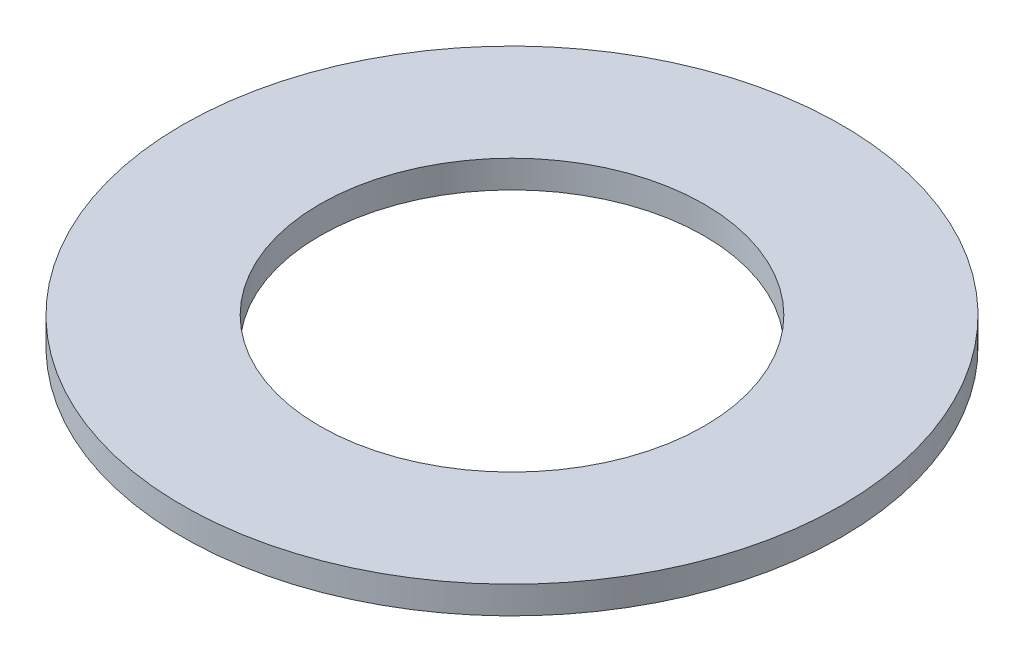
ISO-10303-21;
HEADER;
FILE_DESCRIPTION(('STEP AP214'),'2;1');
FILE_NAME('part.step','',(''),(''),'','','');
FILE_SCHEMA(('AUTOMOTIVE_DESIGN { 1 0 10303 214 1 1 1 1 }'));
ENDSEC;
DATA;
#1=APPLICATION_CONTEXT('core data for automotive mechanical design processes');
#2=APPLICATION_PROTOCOL_DEFINITION('international standard','automotive_design',2000,#1);
#3=PRODUCT_CONTEXT('',#1,'mechanical');
#4=PRODUCT('Part','Part','',(#3));
#5=PRODUCT_RELATED_PRODUCT_CATEGORY('part','',(#4));
#6=PRODUCT_DEFINITION_FORMATION('','',#4);
#7=PRODUCT_DEFINITION_CONTEXT('part definition',#1,'design');
#8=PRODUCT_DEFINITION('design','',#6,#7);
#9=PRODUCT_DEFINITION_SHAPE('','',#8);
#10=(LENGTH_UNIT() NAMED_UNIT(*) SI_UNIT(.MILLI.,.METRE.));
#11=(NAMED_UNIT(*) PLANE_ANGLE_UNIT() SI_UNIT($,.RADIAN.));
#12=(NAMED_UNIT(*) SI_UNIT($,.STERADIAN.) SOLID_ANGLE_UNIT());
#13=UNCERTAINTY_MEASURE_WITH_UNIT(LENGTH_MEASURE(1.E-05),#10,'distance_accuracy_value','');
#14=(GEOMETRIC_REPRESENTATION_CONTEXT(3) GLOBAL_UNCERTAINTY_ASSIGNED_CONTEXT((#13)) GLOBAL_UNIT_ASSIGNED_CONTEXT((#10,
#11,#12)) REPRESENTATION_CONTEXT('',''));
#15=CARTESIAN_POINT('',(0.,0.,0.));
#16=DIRECTION('',(0.,0.,1.));
#17=DIRECTION('',(1.,0.,0.));
#18=AXIS2_PLACEMENT_3D('',#15,#16,#17);
#19=CARTESIAN_POINT('',(0.,1.,0.));
#20=DIRECTION('',(0.,1.,0.));
#21=DIRECTION('',(0.,0.,-1.));
#22=AXIS2_PLACEMENT_3D('',#19,#20,#21);
#23=PLANE('',#22);
#24=CARTESIAN_POINT('',(0.,1.,0.));
#25=DIRECTION('',(0.,-1.,0.));
#26=DIRECTION('',(1.,0.,0.));
#27=AXIS2_PLACEMENT_3D('',#24,#25,#26);
#28=CIRCLE('',#27,12.);
#29=CARTESIAN_POINT('',(12.,1.,0.));
#30=VERTEX_POINT('',#29);
#31=EDGE_CURVE('E10',#30,#30,#28,.T.);
#32=ORIENTED_EDGE('',*,*,#31,.F.);
#33=EDGE_LOOP('',(#32));
#34=FACE_BOUND('',#33,.T.);
#35=CARTESIAN_POINT('',(0.,1.,0.));
#36=DIRECTION('',(0.,-1.,0.));
#37=DIRECTION('',(0.,0.,-1.));
#38=AXIS2_PLACEMENT_3D('',#35,#36,#37);
#39=CIRCLE('',#38,7.);
#40=CARTESIAN_POINT('',(0.,1.,-7.));
#41=VERTEX_POINT('',#40);
#42=EDGE_CURVE('E46',#41,#41,#39,.T.);
#43=ORIENTED_EDGE('',*,*,#42,.T.);
#44=EDGE_LOOP('',(#43));
#45=FACE_BOUND('',#44,.T.);
#46=ADVANCED_FACE('F35',(#34,#45),#23,.T.);
#47=CARTESIAN_POINT('',(0.,0.,0.));
#48=DIRECTION('',(0.,1.,0.));
#49=DIRECTION('',(0.,0.,-1.));
#50=AXIS2_PLACEMENT_3D('',#47,#48,#49);
#51=PLANE('',#50);
#52=CARTESIAN_POINT('',(0.,0.,0.));
#53=DIRECTION('',(0.,-1.,0.));
#54=DIRECTION('',(1.,0.,0.));
#55=AXIS2_PLACEMENT_3D('',#52,#53,#54);
#56=CIRCLE('',#55,12.);
#57=CARTESIAN_POINT('',(12.,0.,0.));
#58=VERTEX_POINT('',#57);
#59=EDGE_CURVE('E39',#58,#58,#56,.T.);
#60=ORIENTED_EDGE('',*,*,#59,.T.);
#61=EDGE_LOOP('',(#60));
#62=FACE_BOUND('',#61,.T.);
#63=CARTESIAN_POINT('',(0.,0.,0.));
#64=DIRECTION('',(0.,-1.,0.));
#65=DIRECTION('',(0.,0.,-1.));
#66=AXIS2_PLACEMENT_3D('',#63,#64,#65);
#67=CIRCLE('',#66,7.);
#68=CARTESIAN_POINT('',(0.,0.,-7.));
#69=VERTEX_POINT('',#68);
#70=EDGE_CURVE('E48',#69,#69,#67,.T.);
#71=ORIENTED_EDGE('',*,*,#70,.F.);
#72=EDGE_LOOP('',(#71));
#73=FACE_BOUND('',#72,.T.);
#74=ADVANCED_FACE('F61',(#62,#73),#51,.F.);
#75=CARTESIAN_POINT('',(0.,1.,0.));
#76=DIRECTION('',(0.,-1.,0.));
#77=DIRECTION('',(0.,0.,1.));
#78=AXIS2_PLACEMENT_3D('',#75,#76,#77);
#79=CYLINDRICAL_SURFACE('',#78,12.);
#80=ORIENTED_EDGE('',*,*,#31,.T.);
#81=EDGE_LOOP('',(#80));
#82=FACE_BOUND('',#81,.T.);
#83=ORIENTED_EDGE('',*,*,#59,.F.);
#84=EDGE_LOOP('',(#83));
#85=FACE_BOUND('',#84,.T.);
#86=ADVANCED_FACE('F37',(#82,#85),#79,.T.);
#87=CARTESIAN_POINT('',(0.,1.,0.));
#88=DIRECTION('',(0.,-1.,0.));
#89=DIRECTION('',(0.,0.,1.));
#90=AXIS2_PLACEMENT_3D('',#87,#88,#89);
#91=CYLINDRICAL_SURFACE('',#90,7.);
#92=ORIENTED_EDGE('',*,*,#42,.F.);
#93=EDGE_LOOP('',(#92));
#94=FACE_BOUND('',#93,.T.);
#95=ORIENTED_EDGE('',*,*,#70,.T.);
#96=EDGE_LOOP('',(#95));
#97=FACE_BOUND('',#96,.T.);
#98=ADVANCED_FACE('F55',(#94,#97),#91,.F.);
#99=CLOSED_SHELL('',(#46,#74,#86,#98));
#100=MANIFOLD_SOLID_BREP('B2',#99);
#101=ADVANCED_BREP_SHAPE_REPRESENTATION('',(#18,#100),#14);
#102=SHAPE_DEFINITION_REPRESENTATION(#9,#101);
ENDSEC;
END-ISO-10303-21;
